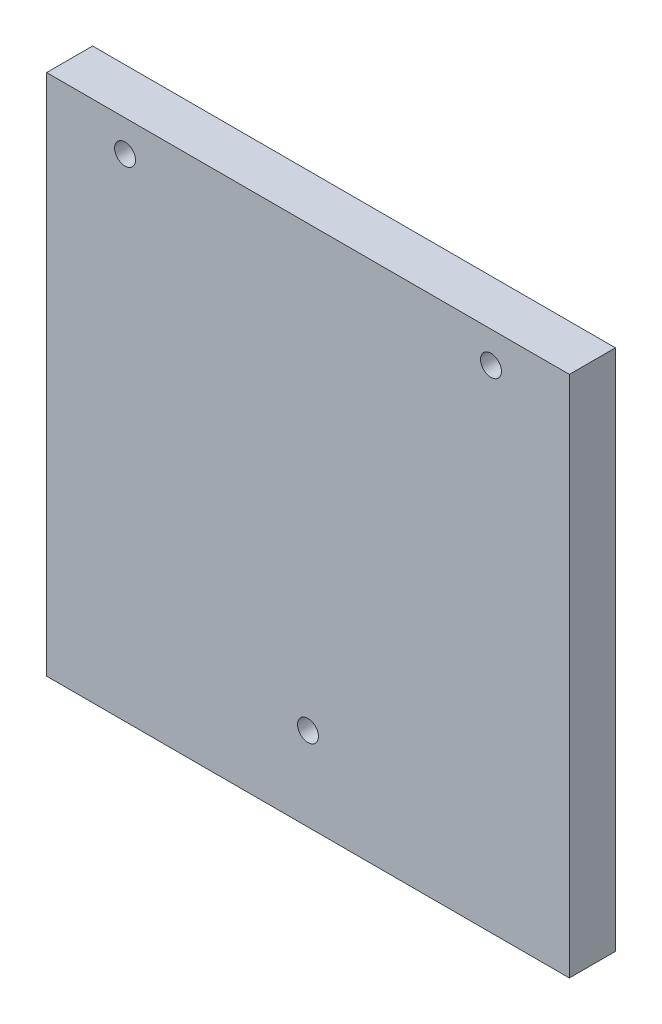
ISO-10303-21;
HEADER;
FILE_DESCRIPTION(('STEP AP214'),'2;1');
FILE_NAME('part.step','',(''),(''),'','','');
FILE_SCHEMA(('AUTOMOTIVE_DESIGN { 1 0 10303 214 1 1 1 1 }'));
ENDSEC;
DATA;
#1=APPLICATION_CONTEXT('core data for automotive mechanical design processes');
#2=APPLICATION_PROTOCOL_DEFINITION('international standard','automotive_design',2000,#1);
#3=PRODUCT_CONTEXT('',#1,'mechanical');
#4=PRODUCT('Part','Part','',(#3));
#5=PRODUCT_RELATED_PRODUCT_CATEGORY('part','',(#4));
#6=PRODUCT_DEFINITION_FORMATION('','',#4);
#7=PRODUCT_DEFINITION_CONTEXT('part definition',#1,'design');
#8=PRODUCT_DEFINITION('design','',#6,#7);
#9=PRODUCT_DEFINITION_SHAPE('','',#8);
#10=(LENGTH_UNIT() NAMED_UNIT(*) SI_UNIT(.MILLI.,.METRE.));
#11=(NAMED_UNIT(*) PLANE_ANGLE_UNIT() SI_UNIT($,.RADIAN.));
#12=(NAMED_UNIT(*) SI_UNIT($,.STERADIAN.) SOLID_ANGLE_UNIT());
#13=UNCERTAINTY_MEASURE_WITH_UNIT(LENGTH_MEASURE(1.E-05),#10,'distance_accuracy_value','');
#14=(GEOMETRIC_REPRESENTATION_CONTEXT(3) GLOBAL_UNCERTAINTY_ASSIGNED_CONTEXT((#13)) GLOBAL_UNIT_ASSIGNED_CONTEXT((#10,
#11,#12)) REPRESENTATION_CONTEXT('',''));
#15=CARTESIAN_POINT('',(0.,0.,0.));
#16=DIRECTION('',(0.,0.,1.));
#17=DIRECTION('',(1.,0.,0.));
#18=AXIS2_PLACEMENT_3D('',#15,#16,#17);
#19=CARTESIAN_POINT('',(-125.,-125.,22.));
#20=DIRECTION('',(1.,0.,0.));
#21=DIRECTION('',(0.,0.,-1.));
#22=AXIS2_PLACEMENT_3D('',#19,#20,#21);
#23=PLANE('',#22);
#24=DIRECTION('',(0.,-1.,0.));
#25=VECTOR('',#24,1.);
#26=CARTESIAN_POINT('',(-125.,-125.,0.));
#27=LINE('',#26,#25);
#28=CARTESIAN_POINT('',(-125.,125.,0.));
#29=VERTEX_POINT('',#28);
#30=CARTESIAN_POINT('',(-125.,-125.,0.));
#31=VERTEX_POINT('',#30);
#32=EDGE_CURVE('E102',#29,#31,#27,.T.);
#33=ORIENTED_EDGE('',*,*,#32,.T.);
#34=DIRECTION('',(0.,0.,-1.));
#35=VECTOR('',#34,1.);
#36=CARTESIAN_POINT('',(-125.,-125.,22.));
#37=LINE('',#36,#35);
#38=CARTESIAN_POINT('',(-125.,-125.,22.));
#39=VERTEX_POINT('',#38);
#40=EDGE_CURVE('E11',#39,#31,#37,.T.);
#41=ORIENTED_EDGE('',*,*,#40,.F.);
#42=DIRECTION('',(0.,-1.,0.));
#43=VECTOR('',#42,1.);
#44=CARTESIAN_POINT('',(-125.,-125.,22.));
#45=LINE('',#44,#43);
#46=CARTESIAN_POINT('',(-125.,125.,22.));
#47=VERTEX_POINT('',#46);
#48=EDGE_CURVE('E89',#47,#39,#45,.T.);
#49=ORIENTED_EDGE('',*,*,#48,.F.);
#50=DIRECTION('',(0.,0.,-1.));
#51=VECTOR('',#50,1.);
#52=CARTESIAN_POINT('',(-125.,125.,22.));
#53=LINE('',#52,#51);
#54=EDGE_CURVE('E98',#47,#29,#53,.T.);
#55=ORIENTED_EDGE('',*,*,#54,.T.);
#56=EDGE_LOOP('',(#33,#41,#49,#55));
#57=FACE_BOUND('',#56,.T.);
#58=ADVANCED_FACE('F36',(#57),#23,.F.);
#59=CARTESIAN_POINT('',(125.,-125.,22.));
#60=DIRECTION('',(0.,1.,0.));
#61=DIRECTION('',(-1.,0.,0.));
#62=AXIS2_PLACEMENT_3D('',#59,#60,#61);
#63=PLANE('',#62);
#64=DIRECTION('',(1.,0.,0.));
#65=VECTOR('',#64,1.);
#66=CARTESIAN_POINT('',(125.,-125.,0.));
#67=LINE('',#66,#65);
#68=CARTESIAN_POINT('',(125.,-125.,0.));
#69=VERTEX_POINT('',#68);
#70=EDGE_CURVE('E93',#31,#69,#67,.T.);
#71=ORIENTED_EDGE('',*,*,#70,.T.);
#72=DIRECTION('',(0.,0.,-1.));
#73=VECTOR('',#72,1.);
#74=CARTESIAN_POINT('',(125.,-125.,22.));
#75=LINE('',#74,#73);
#76=CARTESIAN_POINT('',(125.,-125.,22.));
#77=VERTEX_POINT('',#76);
#78=EDGE_CURVE('E45',#77,#69,#75,.T.);
#79=ORIENTED_EDGE('',*,*,#78,.F.);
#80=DIRECTION('',(1.,0.,0.));
#81=VECTOR('',#80,1.);
#82=CARTESIAN_POINT('',(125.,-125.,22.));
#83=LINE('',#82,#81);
#84=EDGE_CURVE('E84',#39,#77,#83,.T.);
#85=ORIENTED_EDGE('',*,*,#84,.F.);
#86=ORIENTED_EDGE('',*,*,#40,.T.);
#87=EDGE_LOOP('',(#71,#79,#85,#86));
#88=FACE_BOUND('',#87,.T.);
#89=ADVANCED_FACE('F92',(#88),#63,.F.);
#90=CARTESIAN_POINT('',(125.,-125.,22.));
#91=DIRECTION('',(-1.,0.,0.));
#92=DIRECTION('',(0.,0.,1.));
#93=AXIS2_PLACEMENT_3D('',#90,#91,#92);
#94=PLANE('',#93);
#95=DIRECTION('',(0.,1.,0.));
#96=VECTOR('',#95,1.);
#97=CARTESIAN_POINT('',(125.,-125.,0.));
#98=LINE('',#97,#96);
#99=CARTESIAN_POINT('',(125.,125.,0.));
#100=VERTEX_POINT('',#99);
#101=EDGE_CURVE('E71',#69,#100,#98,.T.);
#102=ORIENTED_EDGE('',*,*,#101,.T.);
#103=DIRECTION('',(0.,0.,-1.));
#104=VECTOR('',#103,1.);
#105=CARTESIAN_POINT('',(125.,125.,22.));
#106=LINE('',#105,#104);
#107=CARTESIAN_POINT('',(125.,125.,22.));
#108=VERTEX_POINT('',#107);
#109=EDGE_CURVE('E94',#108,#100,#106,.T.);
#110=ORIENTED_EDGE('',*,*,#109,.F.);
#111=DIRECTION('',(0.,1.,0.));
#112=VECTOR('',#111,1.);
#113=CARTESIAN_POINT('',(125.,-125.,22.));
#114=LINE('',#113,#112);
#115=EDGE_CURVE('E87',#77,#108,#114,.T.);
#116=ORIENTED_EDGE('',*,*,#115,.F.);
#117=ORIENTED_EDGE('',*,*,#78,.T.);
#118=EDGE_LOOP('',(#102,#110,#116,#117));
#119=FACE_BOUND('',#118,.T.);
#120=ADVANCED_FACE('F96',(#119),#94,.F.);
#121=CARTESIAN_POINT('',(125.,125.,22.));
#122=DIRECTION('',(0.,-1.,0.));
#123=DIRECTION('',(1.,0.,0.));
#124=AXIS2_PLACEMENT_3D('',#121,#122,#123);
#125=PLANE('',#124);
#126=DIRECTION('',(-1.,0.,0.));
#127=VECTOR('',#126,1.);
#128=CARTESIAN_POINT('',(125.,125.,0.));
#129=LINE('',#128,#127);
#130=EDGE_CURVE('E77',#100,#29,#129,.T.);
#131=ORIENTED_EDGE('',*,*,#130,.T.);
#132=ORIENTED_EDGE('',*,*,#54,.F.);
#133=DIRECTION('',(-1.,0.,0.));
#134=VECTOR('',#133,1.);
#135=CARTESIAN_POINT('',(125.,125.,22.));
#136=LINE('',#135,#134);
#137=EDGE_CURVE('E54',#108,#47,#136,.T.);
#138=ORIENTED_EDGE('',*,*,#137,.F.);
#139=ORIENTED_EDGE('',*,*,#109,.T.);
#140=EDGE_LOOP('',(#131,#132,#138,#139));
#141=FACE_BOUND('',#140,.T.);
#142=ADVANCED_FACE('F135',(#141),#125,.F.);
#143=CARTESIAN_POINT('',(0.,0.,22.));
#144=DIRECTION('',(0.,0.,1.));
#145=DIRECTION('',(1.,0.,0.));
#146=AXIS2_PLACEMENT_3D('',#143,#144,#145);
#147=PLANE('',#146);
#148=CARTESIAN_POINT('',(87.4999999999999,109.999999999999,22.));
#149=DIRECTION('',(0.,0.,1.));
#150=DIRECTION('',(1.,0.,0.));
#151=AXIS2_PLACEMENT_3D('',#148,#149,#150);
#152=CIRCLE('',#151,4.99999999999996);
#153=CARTESIAN_POINT('',(92.4999999999999,109.999999999999,22.));
#154=VERTEX_POINT('',#153);
#155=EDGE_CURVE('E116',#154,#154,#152,.T.);
#156=ORIENTED_EDGE('',*,*,#155,.F.);
#157=EDGE_LOOP('',(#156));
#158=FACE_BOUND('',#157,.T.);
#159=CARTESIAN_POINT('',(-87.5000000000001,109.999999999999,22.));
#160=DIRECTION('',(0.,0.,1.));
#161=DIRECTION('',(1.,0.,0.));
#162=AXIS2_PLACEMENT_3D('',#159,#160,#161);
#163=CIRCLE('',#162,4.99999999999996);
#164=CARTESIAN_POINT('',(-82.5000000000001,109.999999999999,22.));
#165=VERTEX_POINT('',#164);
#166=EDGE_CURVE('E113',#165,#165,#163,.T.);
#167=ORIENTED_EDGE('',*,*,#166,.F.);
#168=EDGE_LOOP('',(#167));
#169=FACE_BOUND('',#168,.T.);
#170=CARTESIAN_POINT('',(0.,-84.9999999999999,22.));
#171=DIRECTION('',(0.,0.,1.));
#172=DIRECTION('',(1.,0.,0.));
#173=AXIS2_PLACEMENT_3D('',#170,#171,#172);
#174=CIRCLE('',#173,4.99999999999996);
#175=CARTESIAN_POINT('',(4.99999999999997,-84.9999999999999,22.));
#176=VERTEX_POINT('',#175);
#177=EDGE_CURVE('E105',#176,#176,#174,.T.);
#178=ORIENTED_EDGE('',*,*,#177,.F.);
#179=EDGE_LOOP('',(#178));
#180=FACE_BOUND('',#179,.T.);
#181=ORIENTED_EDGE('',*,*,#48,.T.);
#182=ORIENTED_EDGE('',*,*,#84,.T.);
#183=ORIENTED_EDGE('',*,*,#115,.T.);
#184=ORIENTED_EDGE('',*,*,#137,.T.);
#185=EDGE_LOOP('',(#181,#182,#183,#184));
#186=FACE_BOUND('',#185,.T.);
#187=ADVANCED_FACE('F85',(#158,#169,#180,#186),#147,.T.);
#188=CARTESIAN_POINT('',(0.,0.,0.));
#189=DIRECTION('',(0.,0.,1.));
#190=DIRECTION('',(1.,0.,0.));
#191=AXIS2_PLACEMENT_3D('',#188,#189,#190);
#192=PLANE('',#191);
#193=CARTESIAN_POINT('',(87.4999999999999,109.999999999999,0.));
#194=DIRECTION('',(0.,0.,1.));
#195=DIRECTION('',(1.,0.,0.));
#196=AXIS2_PLACEMENT_3D('',#193,#194,#195);
#197=CIRCLE('',#196,4.99999999999996);
#198=CARTESIAN_POINT('',(92.4999999999999,109.999999999999,0.));
#199=VERTEX_POINT('',#198);
#200=EDGE_CURVE('E39',#199,#199,#197,.T.);
#201=ORIENTED_EDGE('',*,*,#200,.T.);
#202=EDGE_LOOP('',(#201));
#203=FACE_BOUND('',#202,.T.);
#204=CARTESIAN_POINT('',(-87.5000000000001,109.999999999999,0.));
#205=DIRECTION('',(0.,0.,1.));
#206=DIRECTION('',(1.,0.,0.));
#207=AXIS2_PLACEMENT_3D('',#204,#205,#206);
#208=CIRCLE('',#207,4.99999999999996);
#209=CARTESIAN_POINT('',(-82.5000000000001,109.999999999999,0.));
#210=VERTEX_POINT('',#209);
#211=EDGE_CURVE('E114',#210,#210,#208,.T.);
#212=ORIENTED_EDGE('',*,*,#211,.T.);
#213=EDGE_LOOP('',(#212));
#214=FACE_BOUND('',#213,.T.);
#215=CARTESIAN_POINT('',(0.,-84.9999999999999,0.));
#216=DIRECTION('',(0.,0.,1.));
#217=DIRECTION('',(1.,0.,0.));
#218=AXIS2_PLACEMENT_3D('',#215,#216,#217);
#219=CIRCLE('',#218,4.99999999999996);
#220=CARTESIAN_POINT('',(4.99999999999997,-84.9999999999999,0.));
#221=VERTEX_POINT('',#220);
#222=EDGE_CURVE('E111',#221,#221,#219,.T.);
#223=ORIENTED_EDGE('',*,*,#222,.T.);
#224=EDGE_LOOP('',(#223));
#225=FACE_BOUND('',#224,.T.);
#226=ORIENTED_EDGE('',*,*,#32,.F.);
#227=ORIENTED_EDGE('',*,*,#130,.F.);
#228=ORIENTED_EDGE('',*,*,#101,.F.);
#229=ORIENTED_EDGE('',*,*,#70,.F.);
#230=EDGE_LOOP('',(#226,#227,#228,#229));
#231=FACE_BOUND('',#230,.T.);
#232=ADVANCED_FACE('F134',(#203,#214,#225,#231),#192,.F.);
#233=CARTESIAN_POINT('',(0.,-84.9999999999999,-30.));
#234=DIRECTION('',(0.,0.,-1.));
#235=DIRECTION('',(-1.,0.,0.));
#236=AXIS2_PLACEMENT_3D('',#233,#234,#235);
#237=CYLINDRICAL_SURFACE('',#236,4.99999999999996);
#238=ORIENTED_EDGE('',*,*,#177,.T.);
#239=EDGE_LOOP('',(#238));
#240=FACE_BOUND('',#239,.T.);
#241=ORIENTED_EDGE('',*,*,#222,.F.);
#242=EDGE_LOOP('',(#241));
#243=FACE_BOUND('',#242,.T.);
#244=ADVANCED_FACE('F130',(#240,#243),#237,.F.);
#245=CARTESIAN_POINT('',(-87.5000000000001,109.999999999999,-30.));
#246=DIRECTION('',(0.,0.,-1.));
#247=DIRECTION('',(-1.,0.,0.));
#248=AXIS2_PLACEMENT_3D('',#245,#246,#247);
#249=CYLINDRICAL_SURFACE('',#248,4.99999999999996);
#250=ORIENTED_EDGE('',*,*,#166,.T.);
#251=EDGE_LOOP('',(#250));
#252=FACE_BOUND('',#251,.T.);
#253=ORIENTED_EDGE('',*,*,#211,.F.);
#254=EDGE_LOOP('',(#253));
#255=FACE_BOUND('',#254,.T.);
#256=ADVANCED_FACE('F183',(#252,#255),#249,.F.);
#257=CARTESIAN_POINT('',(87.4999999999999,109.999999999999,-30.));
#258=DIRECTION('',(0.,0.,-1.));
#259=DIRECTION('',(-1.,0.,0.));
#260=AXIS2_PLACEMENT_3D('',#257,#258,#259);
#261=CYLINDRICAL_SURFACE('',#260,4.99999999999996);
#262=ORIENTED_EDGE('',*,*,#155,.T.);
#263=EDGE_LOOP('',(#262));
#264=FACE_BOUND('',#263,.T.);
#265=ORIENTED_EDGE('',*,*,#200,.F.);
#266=EDGE_LOOP('',(#265));
#267=FACE_BOUND('',#266,.T.);
#268=ADVANCED_FACE('F188',(#264,#267),#261,.F.);
#269=CLOSED_SHELL('',(#58,#89,#120,#142,#187,#232,#244,#256,#268));
#270=MANIFOLD_SOLID_BREP('B2',#269);
#271=ADVANCED_BREP_SHAPE_REPRESENTATION('',(#18,#270),#14);
#272=SHAPE_DEFINITION_REPRESENTATION(#9,#271);
ENDSEC;
END-ISO-10303-21;
